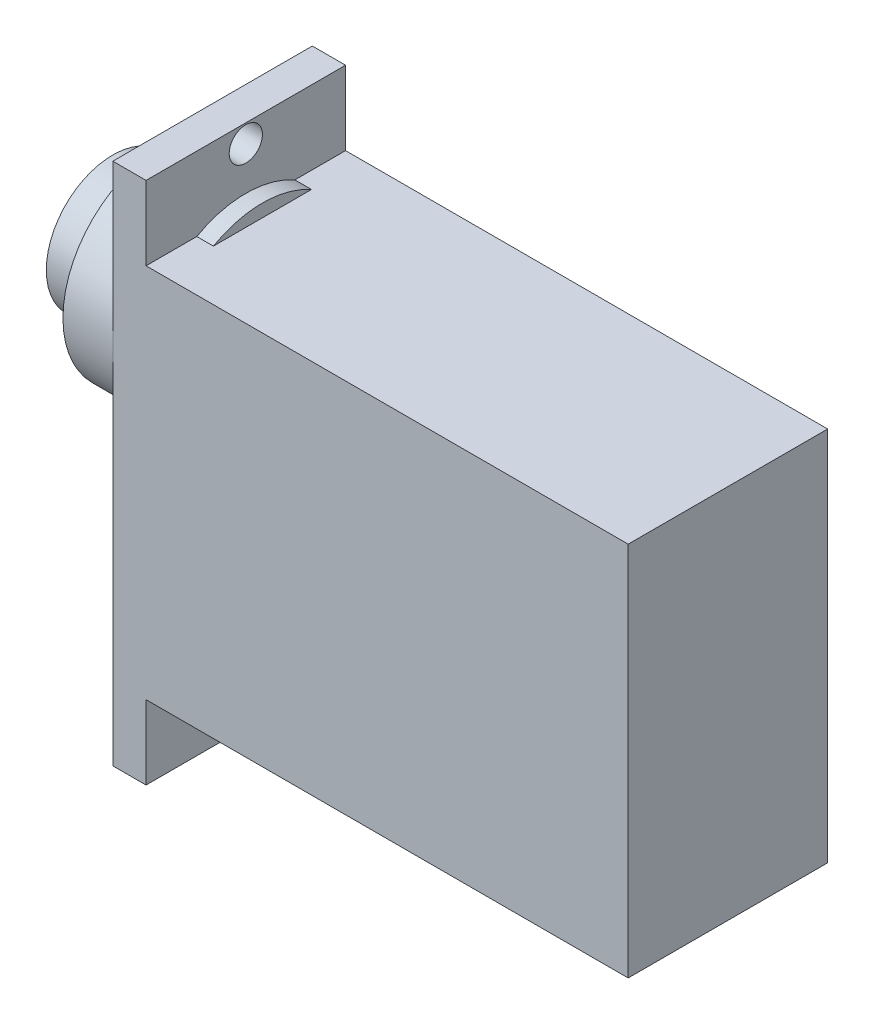
ISO-10303-21;
HEADER;
FILE_DESCRIPTION(('STEP AP214'),'2;1');
FILE_NAME('part.step','',(''),(''),'','','');
FILE_SCHEMA(('AUTOMOTIVE_DESIGN { 1 0 10303 214 1 1 1 1 }'));
ENDSEC;
DATA;
#1=APPLICATION_CONTEXT('core data for automotive mechanical design processes');
#2=APPLICATION_PROTOCOL_DEFINITION('international standard','automotive_design',2000,#1);
#3=PRODUCT_CONTEXT('',#1,'mechanical');
#4=PRODUCT('Part','Part','',(#3));
#5=PRODUCT_RELATED_PRODUCT_CATEGORY('part','',(#4));
#6=PRODUCT_DEFINITION_FORMATION('','',#4);
#7=PRODUCT_DEFINITION_CONTEXT('part definition',#1,'design');
#8=PRODUCT_DEFINITION('design','',#6,#7);
#9=PRODUCT_DEFINITION_SHAPE('','',#8);
#10=(LENGTH_UNIT() NAMED_UNIT(*) SI_UNIT(.MILLI.,.METRE.));
#11=(NAMED_UNIT(*) PLANE_ANGLE_UNIT() SI_UNIT($,.RADIAN.));
#12=(NAMED_UNIT(*) SI_UNIT($,.STERADIAN.) SOLID_ANGLE_UNIT());
#13=UNCERTAINTY_MEASURE_WITH_UNIT(LENGTH_MEASURE(1.E-05),#10,'distance_accuracy_value','');
#14=(GEOMETRIC_REPRESENTATION_CONTEXT(3) GLOBAL_UNCERTAINTY_ASSIGNED_CONTEXT((#13)) GLOBAL_UNIT_ASSIGNED_CONTEXT((#10,
#11,#12)) REPRESENTATION_CONTEXT('',''));
#15=CARTESIAN_POINT('',(0.,0.,0.));
#16=DIRECTION('',(0.,0.,1.));
#17=DIRECTION('',(1.,0.,0.));
#18=AXIS2_PLACEMENT_3D('',#15,#16,#17);
#19=CARTESIAN_POINT('',(0.,11.3,0.));
#20=DIRECTION('',(0.,-1.,0.));
#21=DIRECTION('',(0.,0.,-1.));
#22=AXIS2_PLACEMENT_3D('',#19,#20,#21);
#23=PLANE('',#22);
#24=DIRECTION('',(1.,0.,0.));
#25=VECTOR('',#24,1.);
#26=CARTESIAN_POINT('',(-18.5,11.3,-2.94985040620778));
#27=LINE('',#26,#25);
#28=CARTESIAN_POINT('',(-12.5,11.3,-2.94985040620778));
#29=VERTEX_POINT('',#28);
#30=CARTESIAN_POINT('',(-13.5,11.3,-2.94985040620778));
#31=VERTEX_POINT('',#30);
#32=EDGE_CURVE('E70',#29,#31,#27,.F.);
#33=ORIENTED_EDGE('',*,*,#32,.F.);
#34=DIRECTION('',(0.,0.,-1.));
#35=VECTOR('',#34,1.);
#36=CARTESIAN_POINT('',(-12.5,11.3,0.));
#37=LINE('',#36,#35);
#38=CARTESIAN_POINT('',(-12.5,11.3,2.94985040620778));
#39=VERTEX_POINT('',#38);
#40=EDGE_CURVE('E140',#39,#29,#37,.T.);
#41=ORIENTED_EDGE('',*,*,#40,.F.);
#42=DIRECTION('',(1.,0.,0.));
#43=VECTOR('',#42,1.);
#44=CARTESIAN_POINT('',(-18.5,11.3,2.94985040620778));
#45=LINE('',#44,#43);
#46=CARTESIAN_POINT('',(-13.5,11.3,2.94985040620778));
#47=VERTEX_POINT('',#46);
#48=EDGE_CURVE('E128',#47,#39,#45,.T.);
#49=ORIENTED_EDGE('',*,*,#48,.F.);
#50=DIRECTION('',(0.,0.,-1.));
#51=VECTOR('',#50,1.);
#52=CARTESIAN_POINT('',(-13.5,11.3,6.));
#53=LINE('',#52,#51);
#54=CARTESIAN_POINT('',(-13.5,11.3,6.));
#55=VERTEX_POINT('',#54);
#56=EDGE_CURVE('E214',#55,#47,#53,.T.);
#57=ORIENTED_EDGE('',*,*,#56,.F.);
#58=DIRECTION('',(1.,0.,0.));
#59=VECTOR('',#58,1.);
#60=CARTESIAN_POINT('',(-15.5,11.3,6.));
#61=LINE('',#60,#59);
#62=CARTESIAN_POINT('',(15.5,11.3,6.));
#63=VERTEX_POINT('',#62);
#64=EDGE_CURVE('E226',#55,#63,#61,.T.);
#65=ORIENTED_EDGE('',*,*,#64,.T.);
#66=DIRECTION('',(0.,0.,-1.));
#67=VECTOR('',#66,1.);
#68=CARTESIAN_POINT('',(15.5,11.3,6.));
#69=LINE('',#68,#67);
#70=CARTESIAN_POINT('',(15.5,11.3,-6.));
#71=VERTEX_POINT('',#70);
#72=EDGE_CURVE('E217',#63,#71,#69,.T.);
#73=ORIENTED_EDGE('',*,*,#72,.T.);
#74=DIRECTION('',(-1.,0.,0.));
#75=VECTOR('',#74,1.);
#76=CARTESIAN_POINT('',(-15.5,11.3,-6.));
#77=LINE('',#76,#75);
#78=CARTESIAN_POINT('',(-13.5,11.3,-6.));
#79=VERTEX_POINT('',#78);
#80=EDGE_CURVE('E221',#71,#79,#77,.T.);
#81=ORIENTED_EDGE('',*,*,#80,.T.);
#82=EDGE_CURVE('E199',#31,#79,#53,.T.);
#83=ORIENTED_EDGE('',*,*,#82,.F.);
#84=EDGE_LOOP('',(#33,#41,#49,#57,#65,#73,#81,#83));
#85=FACE_BOUND('',#84,.T.);
#86=ADVANCED_FACE('F45',(#85),#23,.F.);
#87=CARTESIAN_POINT('',(-15.5,11.3,6.));
#88=DIRECTION('',(1.,0.,0.));
#89=DIRECTION('',(0.,0.,-1.));
#90=AXIS2_PLACEMENT_3D('',#87,#88,#89);
#91=PLANE('',#90);
#92=CARTESIAN_POINT('',(-15.5,6.07521458995723,0.));
#93=DIRECTION('',(1.,0.,0.));
#94=DIRECTION('',(0.,0.,-1.));
#95=AXIS2_PLACEMENT_3D('',#92,#93,#94);
#96=CIRCLE('',#95,6.);
#97=CARTESIAN_POINT('',(-15.5,6.07521458995723,-6.));
#98=VERTEX_POINT('',#97);
#99=CARTESIAN_POINT('',(-15.5,6.07521458995723,6.));
#100=VERTEX_POINT('',#99);
#101=EDGE_CURVE('E146',#98,#100,#96,.F.);
#102=ORIENTED_EDGE('',*,*,#101,.F.);
#103=DIRECTION('',(0.,-1.,0.));
#104=VECTOR('',#103,1.);
#105=CARTESIAN_POINT('',(-15.5,11.3,-6.));
#106=LINE('',#105,#104);
#107=CARTESIAN_POINT('',(-15.5,-15.75,-6.));
#108=VERTEX_POINT('',#107);
#109=EDGE_CURVE('E247',#98,#108,#106,.T.);
#110=ORIENTED_EDGE('',*,*,#109,.T.);
#111=DIRECTION('',(0.,0.,-1.));
#112=VECTOR('',#111,1.);
#113=CARTESIAN_POINT('',(-15.5,-15.75,6.));
#114=LINE('',#113,#112);
#115=CARTESIAN_POINT('',(-15.5,-15.75,6.));
#116=VERTEX_POINT('',#115);
#117=EDGE_CURVE('E184',#116,#108,#114,.T.);
#118=ORIENTED_EDGE('',*,*,#117,.F.);
#119=DIRECTION('',(0.,-1.,0.));
#120=VECTOR('',#119,1.);
#121=CARTESIAN_POINT('',(-15.5,11.3,6.));
#122=LINE('',#121,#120);
#123=EDGE_CURVE('E242',#100,#116,#122,.T.);
#124=ORIENTED_EDGE('',*,*,#123,.F.);
#125=EDGE_LOOP('',(#102,#110,#118,#124));
#126=FACE_BOUND('',#125,.T.);
#127=CARTESIAN_POINT('',(-15.5,-14.65,0.));
#128=DIRECTION('',(-1.,0.,0.));
#129=DIRECTION('',(0.,0.,1.));
#130=AXIS2_PLACEMENT_3D('',#127,#128,#129);
#131=CIRCLE('',#130,1.);
#132=CARTESIAN_POINT('',(-15.5,-14.65,1.));
#133=VERTEX_POINT('',#132);
#134=EDGE_CURVE('E145',#133,#133,#131,.T.);
#135=ORIENTED_EDGE('',*,*,#134,.F.);
#136=EDGE_LOOP('',(#135));
#137=FACE_BOUND('',#136,.T.);
#138=ADVANCED_FACE('F292',(#126,#137),#91,.F.);
#139=CARTESIAN_POINT('',(0.,-11.3,0.));
#140=DIRECTION('',(0.,-1.,0.));
#141=DIRECTION('',(0.,0.,-1.));
#142=AXIS2_PLACEMENT_3D('',#139,#140,#141);
#143=PLANE('',#142);
#144=DIRECTION('',(1.,0.,0.));
#145=VECTOR('',#144,1.);
#146=CARTESIAN_POINT('',(-15.5,-11.3,6.));
#147=LINE('',#146,#145);
#148=CARTESIAN_POINT('',(-13.5,-11.3,6.));
#149=VERTEX_POINT('',#148);
#150=CARTESIAN_POINT('',(15.5,-11.3,6.));
#151=VERTEX_POINT('',#150);
#152=EDGE_CURVE('E222',#149,#151,#147,.T.);
#153=ORIENTED_EDGE('',*,*,#152,.F.);
#154=DIRECTION('',(0.,0.,-1.));
#155=VECTOR('',#154,1.);
#156=CARTESIAN_POINT('',(-13.5,-11.3,6.));
#157=LINE('',#156,#155);
#158=CARTESIAN_POINT('',(-13.5,-11.3,-6.));
#159=VERTEX_POINT('',#158);
#160=EDGE_CURVE('E179',#149,#159,#157,.T.);
#161=ORIENTED_EDGE('',*,*,#160,.T.);
#162=DIRECTION('',(-1.,0.,0.));
#163=VECTOR('',#162,1.);
#164=CARTESIAN_POINT('',(-15.5,-11.3,-6.));
#165=LINE('',#164,#163);
#166=CARTESIAN_POINT('',(15.5,-11.3,-6.));
#167=VERTEX_POINT('',#166);
#168=EDGE_CURVE('E233',#167,#159,#165,.T.);
#169=ORIENTED_EDGE('',*,*,#168,.F.);
#170=DIRECTION('',(0.,0.,-1.));
#171=VECTOR('',#170,1.);
#172=CARTESIAN_POINT('',(15.5,-11.3,6.));
#173=LINE('',#172,#171);
#174=EDGE_CURVE('E209',#151,#167,#173,.T.);
#175=ORIENTED_EDGE('',*,*,#174,.F.);
#176=EDGE_LOOP('',(#153,#161,#169,#175));
#177=FACE_BOUND('',#176,.T.);
#178=ADVANCED_FACE('F301',(#177),#143,.T.);
#179=CARTESIAN_POINT('',(15.5,11.3,6.));
#180=DIRECTION('',(-1.,0.,0.));
#181=DIRECTION('',(0.,0.,1.));
#182=AXIS2_PLACEMENT_3D('',#179,#180,#181);
#183=PLANE('',#182);
#184=ORIENTED_EDGE('',*,*,#174,.T.);
#185=DIRECTION('',(0.,-1.,0.));
#186=VECTOR('',#185,1.);
#187=CARTESIAN_POINT('',(15.5,11.3,-6.));
#188=LINE('',#187,#186);
#189=EDGE_CURVE('E55',#71,#167,#188,.T.);
#190=ORIENTED_EDGE('',*,*,#189,.F.);
#191=ORIENTED_EDGE('',*,*,#72,.F.);
#192=DIRECTION('',(0.,-1.,0.));
#193=VECTOR('',#192,1.);
#194=CARTESIAN_POINT('',(15.5,11.3,6.));
#195=LINE('',#194,#193);
#196=EDGE_CURVE('E229',#63,#151,#195,.T.);
#197=ORIENTED_EDGE('',*,*,#196,.T.);
#198=EDGE_LOOP('',(#184,#190,#191,#197));
#199=FACE_BOUND('',#198,.T.);
#200=ADVANCED_FACE('F47',(#199),#183,.F.);
#201=CARTESIAN_POINT('',(-15.5,11.3,-6.));
#202=DIRECTION('',(0.,0.,1.));
#203=DIRECTION('',(1.,0.,0.));
#204=AXIS2_PLACEMENT_3D('',#201,#202,#203);
#205=PLANE('',#204);
#206=ORIENTED_EDGE('',*,*,#109,.F.);
#207=CARTESIAN_POINT('',(-15.5,15.75,-6.));
#208=VERTEX_POINT('',#207);
#209=EDGE_CURVE('E248',#208,#98,#106,.T.);
#210=ORIENTED_EDGE('',*,*,#209,.F.);
#211=DIRECTION('',(1.,0.,0.));
#212=VECTOR('',#211,1.);
#213=CARTESIAN_POINT('',(-15.5,15.75,-6.));
#214=LINE('',#213,#212);
#215=CARTESIAN_POINT('',(-13.5,15.75,-6.));
#216=VERTEX_POINT('',#215);
#217=EDGE_CURVE('E195',#208,#216,#214,.T.);
#218=ORIENTED_EDGE('',*,*,#217,.T.);
#219=DIRECTION('',(0.,-1.,0.));
#220=VECTOR('',#219,1.);
#221=CARTESIAN_POINT('',(-13.5,15.75,-6.));
#222=LINE('',#221,#220);
#223=EDGE_CURVE('E183',#216,#79,#222,.T.);
#224=ORIENTED_EDGE('',*,*,#223,.T.);
#225=ORIENTED_EDGE('',*,*,#80,.F.);
#226=ORIENTED_EDGE('',*,*,#189,.T.);
#227=ORIENTED_EDGE('',*,*,#168,.T.);
#228=DIRECTION('',(0.,-1.,0.));
#229=VECTOR('',#228,1.);
#230=CARTESIAN_POINT('',(-13.5,-11.3,-6.));
#231=LINE('',#230,#229);
#232=CARTESIAN_POINT('',(-13.5,-15.75,-6.));
#233=VERTEX_POINT('',#232);
#234=EDGE_CURVE('E171',#159,#233,#231,.T.);
#235=ORIENTED_EDGE('',*,*,#234,.T.);
#236=DIRECTION('',(-1.,0.,0.));
#237=VECTOR('',#236,1.);
#238=CARTESIAN_POINT('',(-15.5,-15.75,-6.));
#239=LINE('',#238,#237);
#240=EDGE_CURVE('E166',#233,#108,#239,.T.);
#241=ORIENTED_EDGE('',*,*,#240,.T.);
#242=EDGE_LOOP('',(#206,#210,#218,#224,#225,#226,#227,#235,#241));
#243=FACE_BOUND('',#242,.T.);
#244=ADVANCED_FACE('F284',(#243),#205,.F.);
#245=EDGE_CURVE('E62',#100,#98,#96,.F.);
#246=ORIENTED_EDGE('',*,*,#245,.F.);
#247=CARTESIAN_POINT('',(-15.5,15.75,6.));
#248=VERTEX_POINT('',#247);
#249=EDGE_CURVE('E243',#248,#100,#122,.T.);
#250=ORIENTED_EDGE('',*,*,#249,.F.);
#251=DIRECTION('',(0.,0.,-1.));
#252=VECTOR('',#251,1.);
#253=CARTESIAN_POINT('',(-15.5,15.75,6.));
#254=LINE('',#253,#252);
#255=EDGE_CURVE('E210',#248,#208,#254,.T.);
#256=ORIENTED_EDGE('',*,*,#255,.T.);
#257=ORIENTED_EDGE('',*,*,#209,.T.);
#258=EDGE_LOOP('',(#246,#250,#256,#257));
#259=FACE_BOUND('',#258,.T.);
#260=CARTESIAN_POINT('',(-15.5,14.65,0.));
#261=DIRECTION('',(-1.,0.,0.));
#262=DIRECTION('',(0.,0.,1.));
#263=AXIS2_PLACEMENT_3D('',#260,#261,#262);
#264=CIRCLE('',#263,1.);
#265=CARTESIAN_POINT('',(-15.5,14.65,1.));
#266=VERTEX_POINT('',#265);
#267=EDGE_CURVE('E151',#266,#266,#264,.T.);
#268=ORIENTED_EDGE('',*,*,#267,.F.);
#269=EDGE_LOOP('',(#268));
#270=FACE_BOUND('',#269,.T.);
#271=ADVANCED_FACE('F311',(#259,#270),#91,.F.);
#272=CARTESIAN_POINT('',(-15.5,11.3,6.));
#273=DIRECTION('',(0.,0.,-1.));
#274=DIRECTION('',(-1.,0.,0.));
#275=AXIS2_PLACEMENT_3D('',#272,#273,#274);
#276=PLANE('',#275);
#277=ORIENTED_EDGE('',*,*,#249,.T.);
#278=ORIENTED_EDGE('',*,*,#123,.T.);
#279=DIRECTION('',(-1.,0.,0.));
#280=VECTOR('',#279,1.);
#281=CARTESIAN_POINT('',(-15.5,-15.75,6.));
#282=LINE('',#281,#280);
#283=CARTESIAN_POINT('',(-13.5,-15.75,6.));
#284=VERTEX_POINT('',#283);
#285=EDGE_CURVE('E165',#284,#116,#282,.T.);
#286=ORIENTED_EDGE('',*,*,#285,.F.);
#287=DIRECTION('',(0.,-1.,0.));
#288=VECTOR('',#287,1.);
#289=CARTESIAN_POINT('',(-13.5,-11.3,6.));
#290=LINE('',#289,#288);
#291=EDGE_CURVE('E161',#149,#284,#290,.T.);
#292=ORIENTED_EDGE('',*,*,#291,.F.);
#293=ORIENTED_EDGE('',*,*,#152,.T.);
#294=ORIENTED_EDGE('',*,*,#196,.F.);
#295=ORIENTED_EDGE('',*,*,#64,.F.);
#296=DIRECTION('',(0.,-1.,0.));
#297=VECTOR('',#296,1.);
#298=CARTESIAN_POINT('',(-13.5,15.75,6.));
#299=LINE('',#298,#297);
#300=CARTESIAN_POINT('',(-13.5,15.75,6.));
#301=VERTEX_POINT('',#300);
#302=EDGE_CURVE('E190',#301,#55,#299,.T.);
#303=ORIENTED_EDGE('',*,*,#302,.F.);
#304=DIRECTION('',(1.,0.,0.));
#305=VECTOR('',#304,1.);
#306=CARTESIAN_POINT('',(-15.5,15.75,6.));
#307=LINE('',#306,#305);
#308=EDGE_CURVE('E194',#248,#301,#307,.T.);
#309=ORIENTED_EDGE('',*,*,#308,.F.);
#310=EDGE_LOOP('',(#277,#278,#286,#292,#293,#294,#295,#303,#309));
#311=FACE_BOUND('',#310,.T.);
#312=ADVANCED_FACE('F268',(#311),#276,.F.);
#313=CARTESIAN_POINT('',(-13.5,15.75,6.));
#314=DIRECTION('',(1.,0.,0.));
#315=DIRECTION('',(0.,1.,0.));
#316=AXIS2_PLACEMENT_3D('',#313,#314,#315);
#317=PLANE('',#316);
#318=CARTESIAN_POINT('',(-13.5,14.65,0.));
#319=DIRECTION('',(1.,0.,0.));
#320=DIRECTION('',(0.,1.,0.));
#321=AXIS2_PLACEMENT_3D('',#318,#319,#320);
#322=CIRCLE('',#321,1.);
#323=CARTESIAN_POINT('',(-13.5,15.65,0.));
#324=VERTEX_POINT('',#323);
#325=EDGE_CURVE('E175',#324,#324,#322,.T.);
#326=ORIENTED_EDGE('',*,*,#325,.F.);
#327=EDGE_LOOP('',(#326));
#328=FACE_BOUND('',#327,.T.);
#329=ORIENTED_EDGE('',*,*,#56,.T.);
#330=CARTESIAN_POINT('',(-13.5,6.07521458995723,0.));
#331=DIRECTION('',(1.,0.,0.));
#332=DIRECTION('',(0.,1.,0.));
#333=AXIS2_PLACEMENT_3D('',#330,#331,#332);
#334=CIRCLE('',#333,6.);
#335=EDGE_CURVE('E11',#47,#31,#334,.F.);
#336=ORIENTED_EDGE('',*,*,#335,.T.);
#337=ORIENTED_EDGE('',*,*,#82,.T.);
#338=ORIENTED_EDGE('',*,*,#223,.F.);
#339=DIRECTION('',(0.,0.,-1.));
#340=VECTOR('',#339,1.);
#341=CARTESIAN_POINT('',(-13.5,15.75,6.));
#342=LINE('',#341,#340);
#343=EDGE_CURVE('E206',#301,#216,#342,.T.);
#344=ORIENTED_EDGE('',*,*,#343,.F.);
#345=ORIENTED_EDGE('',*,*,#302,.T.);
#346=EDGE_LOOP('',(#329,#336,#337,#338,#344,#345));
#347=FACE_BOUND('',#346,.T.);
#348=ADVANCED_FACE('F264',(#328,#347),#317,.T.);
#349=CARTESIAN_POINT('',(-15.5,15.75,6.));
#350=DIRECTION('',(0.,1.,0.));
#351=DIRECTION('',(0.,0.,1.));
#352=AXIS2_PLACEMENT_3D('',#349,#350,#351);
#353=PLANE('',#352);
#354=ORIENTED_EDGE('',*,*,#217,.F.);
#355=ORIENTED_EDGE('',*,*,#255,.F.);
#356=ORIENTED_EDGE('',*,*,#308,.T.);
#357=ORIENTED_EDGE('',*,*,#343,.T.);
#358=EDGE_LOOP('',(#354,#355,#356,#357));
#359=FACE_BOUND('',#358,.T.);
#360=ADVANCED_FACE('F267',(#359),#353,.T.);
#361=CARTESIAN_POINT('',(-13.5,-11.3,6.));
#362=DIRECTION('',(1.,0.,0.));
#363=DIRECTION('',(0.,0.,-1.));
#364=AXIS2_PLACEMENT_3D('',#361,#362,#363);
#365=PLANE('',#364);
#366=CARTESIAN_POINT('',(-13.5,-14.65,0.));
#367=DIRECTION('',(1.,0.,0.));
#368=DIRECTION('',(0.,0.,-1.));
#369=AXIS2_PLACEMENT_3D('',#366,#367,#368);
#370=CIRCLE('',#369,1.);
#371=CARTESIAN_POINT('',(-13.5,-14.65,-1.));
#372=VERTEX_POINT('',#371);
#373=EDGE_CURVE('E159',#372,#372,#370,.T.);
#374=ORIENTED_EDGE('',*,*,#373,.F.);
#375=EDGE_LOOP('',(#374));
#376=FACE_BOUND('',#375,.T.);
#377=ORIENTED_EDGE('',*,*,#234,.F.);
#378=ORIENTED_EDGE('',*,*,#160,.F.);
#379=ORIENTED_EDGE('',*,*,#291,.T.);
#380=DIRECTION('',(0.,0.,-1.));
#381=VECTOR('',#380,1.);
#382=CARTESIAN_POINT('',(-13.5,-15.75,6.));
#383=LINE('',#382,#381);
#384=EDGE_CURVE('E170',#284,#233,#383,.T.);
#385=ORIENTED_EDGE('',*,*,#384,.T.);
#386=EDGE_LOOP('',(#377,#378,#379,#385));
#387=FACE_BOUND('',#386,.T.);
#388=ADVANCED_FACE('F299',(#376,#387),#365,.T.);
#389=CARTESIAN_POINT('',(-15.5,-15.75,6.));
#390=DIRECTION('',(0.,-1.,0.));
#391=DIRECTION('',(0.,0.,-1.));
#392=AXIS2_PLACEMENT_3D('',#389,#390,#391);
#393=PLANE('',#392);
#394=ORIENTED_EDGE('',*,*,#240,.F.);
#395=ORIENTED_EDGE('',*,*,#384,.F.);
#396=ORIENTED_EDGE('',*,*,#285,.T.);
#397=ORIENTED_EDGE('',*,*,#117,.T.);
#398=EDGE_LOOP('',(#394,#395,#396,#397));
#399=FACE_BOUND('',#398,.T.);
#400=ADVANCED_FACE('F296',(#399),#393,.T.);
#401=CARTESIAN_POINT('',(15.5,-14.65,0.));
#402=DIRECTION('',(-1.,0.,0.));
#403=DIRECTION('',(0.,0.,1.));
#404=AXIS2_PLACEMENT_3D('',#401,#402,#403);
#405=CYLINDRICAL_SURFACE('',#404,1.);
#406=ORIENTED_EDGE('',*,*,#373,.T.);
#407=EDGE_LOOP('',(#406));
#408=FACE_BOUND('',#407,.T.);
#409=ORIENTED_EDGE('',*,*,#134,.T.);
#410=EDGE_LOOP('',(#409));
#411=FACE_BOUND('',#410,.T.);
#412=ADVANCED_FACE('F325',(#408,#411),#405,.F.);
#413=CARTESIAN_POINT('',(15.5,14.65,0.));
#414=DIRECTION('',(-1.,0.,0.));
#415=DIRECTION('',(0.,0.,1.));
#416=AXIS2_PLACEMENT_3D('',#413,#414,#415);
#417=CYLINDRICAL_SURFACE('',#416,1.);
#418=ORIENTED_EDGE('',*,*,#325,.T.);
#419=EDGE_LOOP('',(#418));
#420=FACE_BOUND('',#419,.T.);
#421=ORIENTED_EDGE('',*,*,#267,.T.);
#422=EDGE_LOOP('',(#421));
#423=FACE_BOUND('',#422,.T.);
#424=ADVANCED_FACE('F261',(#420,#423),#417,.F.);
#425=CARTESIAN_POINT('',(-18.5,6.07521458995723,0.));
#426=DIRECTION('',(1.,0.,0.));
#427=DIRECTION('',(0.,0.,-1.));
#428=AXIS2_PLACEMENT_3D('',#425,#426,#427);
#429=CYLINDRICAL_SURFACE('',#428,6.);
#430=CARTESIAN_POINT('',(-12.5,6.07521458995723,0.));
#431=DIRECTION('',(-1.,0.,0.));
#432=DIRECTION('',(0.,0.,1.));
#433=AXIS2_PLACEMENT_3D('',#430,#431,#432);
#434=CIRCLE('',#433,6.);
#435=EDGE_CURVE('E131',#39,#29,#434,.T.);
#436=ORIENTED_EDGE('',*,*,#435,.T.);
#437=ORIENTED_EDGE('',*,*,#32,.T.);
#438=ORIENTED_EDGE('',*,*,#335,.F.);
#439=ORIENTED_EDGE('',*,*,#48,.T.);
#440=EDGE_LOOP('',(#436,#437,#438,#439));
#441=FACE_BOUND('',#440,.T.);
#442=ADVANCED_FACE('F130',(#441),#429,.T.);
#443=CARTESIAN_POINT('',(-12.5,6.07521458995723,0.));
#444=DIRECTION('',(-1.,0.,0.));
#445=DIRECTION('',(0.,0.,1.));
#446=AXIS2_PLACEMENT_3D('',#443,#444,#445);
#447=PLANE('',#446);
#448=ORIENTED_EDGE('',*,*,#435,.F.);
#449=ORIENTED_EDGE('',*,*,#40,.T.);
#450=EDGE_LOOP('',(#448,#449));
#451=FACE_BOUND('',#450,.T.);
#452=ADVANCED_FACE('F139',(#451),#447,.F.);
#453=CARTESIAN_POINT('',(-18.5,6.07521458995723,0.));
#454=DIRECTION('',(-1.,0.,0.));
#455=DIRECTION('',(0.,0.,1.));
#456=AXIS2_PLACEMENT_3D('',#453,#454,#455);
#457=CIRCLE('',#456,6.);
#458=CARTESIAN_POINT('',(-18.5,6.07521458995723,6.));
#459=VERTEX_POINT('',#458);
#460=EDGE_CURVE('E136',#459,#459,#457,.T.);
#461=ORIENTED_EDGE('',*,*,#460,.F.);
#462=EDGE_LOOP('',(#461));
#463=FACE_BOUND('',#462,.T.);
#464=ORIENTED_EDGE('',*,*,#245,.T.);
#465=ORIENTED_EDGE('',*,*,#101,.T.);
#466=EDGE_LOOP('',(#464,#465));
#467=FACE_BOUND('',#466,.T.);
#468=ADVANCED_FACE('F330',(#463,#467),#429,.T.);
#469=CARTESIAN_POINT('',(-18.5,6.07521458995723,0.));
#470=DIRECTION('',(-1.,0.,0.));
#471=DIRECTION('',(0.,0.,1.));
#472=AXIS2_PLACEMENT_3D('',#469,#470,#471);
#473=PLANE('',#472);
#474=CARTESIAN_POINT('',(-18.5,6.07521458995723,0.));
#475=DIRECTION('',(-1.,0.,0.));
#476=DIRECTION('',(0.,0.,1.));
#477=AXIS2_PLACEMENT_3D('',#474,#475,#476);
#478=CIRCLE('',#477,4.);
#479=CARTESIAN_POINT('',(-18.5,6.07521458995723,4.));
#480=VERTEX_POINT('',#479);
#481=EDGE_CURVE('E49',#480,#480,#478,.F.);
#482=ORIENTED_EDGE('',*,*,#481,.T.);
#483=EDGE_LOOP('',(#482));
#484=FACE_BOUND('',#483,.T.);
#485=ORIENTED_EDGE('',*,*,#460,.T.);
#486=EDGE_LOOP('',(#485));
#487=FACE_BOUND('',#486,.T.);
#488=ADVANCED_FACE('F333',(#484,#487),#473,.T.);
#489=CARTESIAN_POINT('',(-21.5,6.07521458995723,0.));
#490=DIRECTION('',(1.,0.,0.));
#491=DIRECTION('',(0.,0.,-1.));
#492=AXIS2_PLACEMENT_3D('',#489,#490,#491);
#493=CYLINDRICAL_SURFACE('',#492,4.);
#494=ORIENTED_EDGE('',*,*,#481,.F.);
#495=EDGE_LOOP('',(#494));
#496=FACE_BOUND('',#495,.T.);
#497=CARTESIAN_POINT('',(-21.5,6.07521458995723,0.));
#498=DIRECTION('',(-1.,0.,0.));
#499=DIRECTION('',(0.,0.,1.));
#500=AXIS2_PLACEMENT_3D('',#497,#498,#499);
#501=CIRCLE('',#500,4.);
#502=CARTESIAN_POINT('',(-21.5,6.07521458995723,4.));
#503=VERTEX_POINT('',#502);
#504=EDGE_CURVE('E351',#503,#503,#501,.T.);
#505=ORIENTED_EDGE('',*,*,#504,.F.);
#506=EDGE_LOOP('',(#505));
#507=FACE_BOUND('',#506,.T.);
#508=ADVANCED_FACE('F339',(#496,#507),#493,.T.);
#509=CARTESIAN_POINT('',(-21.5,6.07521458995723,0.));
#510=DIRECTION('',(-1.,0.,0.));
#511=DIRECTION('',(0.,0.,1.));
#512=AXIS2_PLACEMENT_3D('',#509,#510,#511);
#513=PLANE('',#512);
#514=ORIENTED_EDGE('',*,*,#504,.T.);
#515=EDGE_LOOP('',(#514));
#516=FACE_BOUND('',#515,.T.);
#517=ADVANCED_FACE('F343',(#516),#513,.T.);
#518=CLOSED_SHELL('',(#86,#138,#178,#200,#244,#271,#312,#348,#360,#388,#400,#412,#424,#442,#452,
#468,#488,#508,#517));
#519=MANIFOLD_SOLID_BREP('B2',#518);
#520=ADVANCED_BREP_SHAPE_REPRESENTATION('',(#18,#519),#14);
#521=SHAPE_DEFINITION_REPRESENTATION(#9,#520);
ENDSEC;
END-ISO-10303-21;
